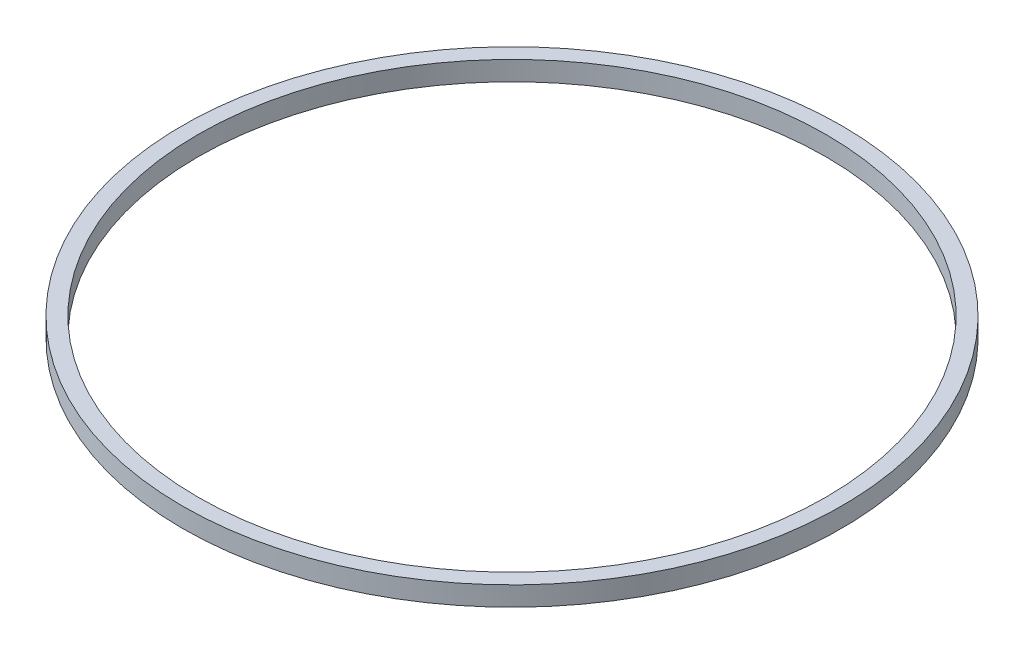
ISO-10303-21;
HEADER;
FILE_DESCRIPTION(('STEP AP214'),'2;1');
FILE_NAME('part.step','',(''),(''),'','','');
FILE_SCHEMA(('AUTOMOTIVE_DESIGN { 1 0 10303 214 1 1 1 1 }'));
ENDSEC;
DATA;
#1=APPLICATION_CONTEXT('core data for automotive mechanical design processes');
#2=APPLICATION_PROTOCOL_DEFINITION('international standard','automotive_design',2000,#1);
#3=PRODUCT_CONTEXT('',#1,'mechanical');
#4=PRODUCT('Part','Part','',(#3));
#5=PRODUCT_RELATED_PRODUCT_CATEGORY('part','',(#4));
#6=PRODUCT_DEFINITION_FORMATION('','',#4);
#7=PRODUCT_DEFINITION_CONTEXT('part definition',#1,'design');
#8=PRODUCT_DEFINITION('design','',#6,#7);
#9=PRODUCT_DEFINITION_SHAPE('','',#8);
#10=(LENGTH_UNIT() NAMED_UNIT(*) SI_UNIT(.MILLI.,.METRE.));
#11=(NAMED_UNIT(*) PLANE_ANGLE_UNIT() SI_UNIT($,.RADIAN.));
#12=(NAMED_UNIT(*) SI_UNIT($,.STERADIAN.) SOLID_ANGLE_UNIT());
#13=UNCERTAINTY_MEASURE_WITH_UNIT(LENGTH_MEASURE(1.E-05),#10,'distance_accuracy_value','');
#14=(GEOMETRIC_REPRESENTATION_CONTEXT(3) GLOBAL_UNCERTAINTY_ASSIGNED_CONTEXT((#13)) GLOBAL_UNIT_ASSIGNED_CONTEXT((#10,
#11,#12)) REPRESENTATION_CONTEXT('',''));
#15=CARTESIAN_POINT('',(0.,0.,0.));
#16=DIRECTION('',(0.,0.,1.));
#17=DIRECTION('',(1.,0.,0.));
#18=AXIS2_PLACEMENT_3D('',#15,#16,#17);
#19=CARTESIAN_POINT('',(0.,5.,0.));
#20=DIRECTION('',(0.,1.,0.));
#21=DIRECTION('',(0.,0.,1.));
#22=AXIS2_PLACEMENT_3D('',#19,#20,#21);
#23=PLANE('',#22);
#24=CARTESIAN_POINT('',(0.,5.,0.));
#25=DIRECTION('',(0.,1.,0.));
#26=DIRECTION('',(0.,0.,1.));
#27=AXIS2_PLACEMENT_3D('',#24,#25,#26);
#28=CIRCLE('',#27,85.);
#29=CARTESIAN_POINT('',(0.,5.,85.));
#30=VERTEX_POINT('',#29);
#31=EDGE_CURVE('E10',#30,#30,#28,.T.);
#32=ORIENTED_EDGE('',*,*,#31,.T.);
#33=EDGE_LOOP('',(#32));
#34=FACE_BOUND('',#33,.T.);
#35=CARTESIAN_POINT('',(0.,5.,0.));
#36=DIRECTION('',(0.,1.,0.));
#37=DIRECTION('',(0.,0.,1.));
#38=AXIS2_PLACEMENT_3D('',#35,#36,#37);
#39=CIRCLE('',#38,81.);
#40=CARTESIAN_POINT('',(0.,5.,81.));
#41=VERTEX_POINT('',#40);
#42=EDGE_CURVE('E56',#41,#41,#39,.T.);
#43=ORIENTED_EDGE('',*,*,#42,.F.);
#44=EDGE_LOOP('',(#43));
#45=FACE_BOUND('',#44,.T.);
#46=ADVANCED_FACE('F43',(#34,#45),#23,.T.);
#47=CARTESIAN_POINT('',(0.,0.,0.));
#48=DIRECTION('',(0.,1.,0.));
#49=DIRECTION('',(0.,0.,1.));
#50=AXIS2_PLACEMENT_3D('',#47,#48,#49);
#51=PLANE('',#50);
#52=CARTESIAN_POINT('',(0.,0.,0.));
#53=DIRECTION('',(0.,1.,0.));
#54=DIRECTION('',(0.,0.,1.));
#55=AXIS2_PLACEMENT_3D('',#52,#53,#54);
#56=CIRCLE('',#55,85.);
#57=CARTESIAN_POINT('',(0.,0.,85.));
#58=VERTEX_POINT('',#57);
#59=EDGE_CURVE('E47',#58,#58,#56,.T.);
#60=ORIENTED_EDGE('',*,*,#59,.F.);
#61=EDGE_LOOP('',(#60));
#62=FACE_BOUND('',#61,.T.);
#63=CARTESIAN_POINT('',(0.,0.,0.));
#64=DIRECTION('',(0.,1.,0.));
#65=DIRECTION('',(0.,0.,1.));
#66=AXIS2_PLACEMENT_3D('',#63,#64,#65);
#67=CIRCLE('',#66,81.);
#68=CARTESIAN_POINT('',(0.,0.,81.));
#69=VERTEX_POINT('',#68);
#70=EDGE_CURVE('E58',#69,#69,#67,.T.);
#71=ORIENTED_EDGE('',*,*,#70,.T.);
#72=EDGE_LOOP('',(#71));
#73=FACE_BOUND('',#72,.T.);
#74=ADVANCED_FACE('F70',(#62,#73),#51,.F.);
#75=CARTESIAN_POINT('',(0.,5.,0.));
#76=DIRECTION('',(0.,-1.,0.));
#77=DIRECTION('',(0.,0.,-1.));
#78=AXIS2_PLACEMENT_3D('',#75,#76,#77);
#79=CYLINDRICAL_SURFACE('',#78,85.);
#80=ORIENTED_EDGE('',*,*,#31,.F.);
#81=EDGE_LOOP('',(#80));
#82=FACE_BOUND('',#81,.T.);
#83=ORIENTED_EDGE('',*,*,#59,.T.);
#84=EDGE_LOOP('',(#83));
#85=FACE_BOUND('',#84,.T.);
#86=ADVANCED_FACE('F45',(#82,#85),#79,.T.);
#87=CARTESIAN_POINT('',(0.,5.,0.));
#88=DIRECTION('',(0.,-1.,0.));
#89=DIRECTION('',(0.,0.,-1.));
#90=AXIS2_PLACEMENT_3D('',#87,#88,#89);
#91=CYLINDRICAL_SURFACE('',#90,81.);
#92=ORIENTED_EDGE('',*,*,#42,.T.);
#93=EDGE_LOOP('',(#92));
#94=FACE_BOUND('',#93,.T.);
#95=ORIENTED_EDGE('',*,*,#70,.F.);
#96=EDGE_LOOP('',(#95));
#97=FACE_BOUND('',#96,.T.);
#98=ADVANCED_FACE('F66',(#94,#97),#91,.F.);
#99=CLOSED_SHELL('',(#46,#74,#86,#98));
#100=MANIFOLD_SOLID_BREP('B2',#99);
#101=ADVANCED_BREP_SHAPE_REPRESENTATION('',(#18,#100),#14);
#102=SHAPE_DEFINITION_REPRESENTATION(#9,#101);
ENDSEC;
END-ISO-10303-21;
